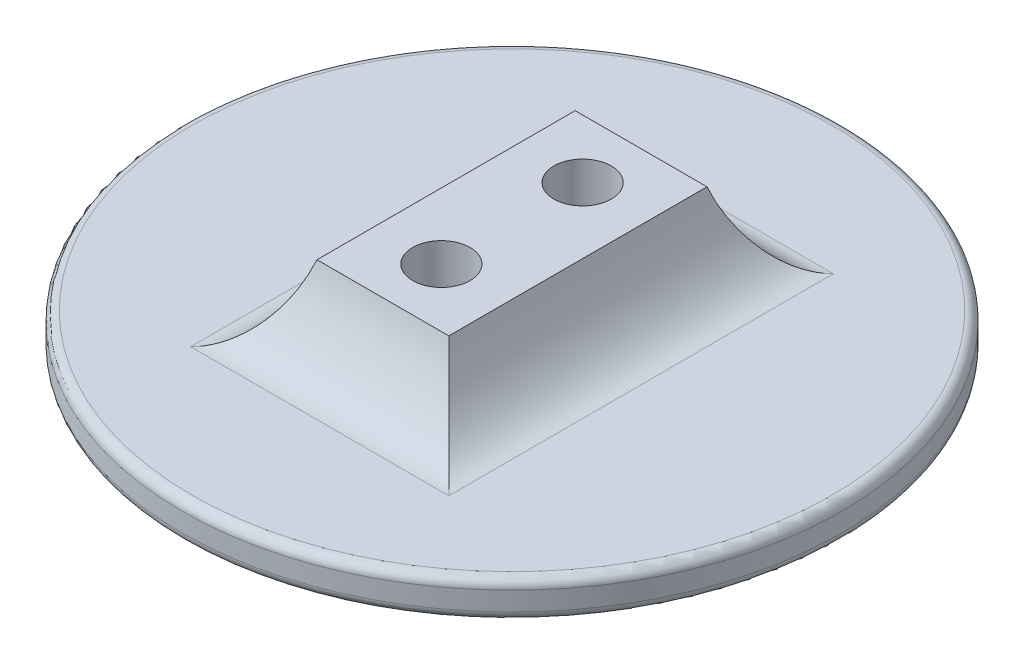
ISO-10303-21;
HEADER;
FILE_DESCRIPTION(('STEP AP214'),'2;1');
FILE_NAME('part.step','',(''),(''),'','','');
FILE_SCHEMA(('AUTOMOTIVE_DESIGN { 1 0 10303 214 1 1 1 1 }'));
ENDSEC;
DATA;
#1=APPLICATION_CONTEXT('core data for automotive mechanical design processes');
#2=APPLICATION_PROTOCOL_DEFINITION('international standard','automotive_design',2000,#1);
#3=PRODUCT_CONTEXT('',#1,'mechanical');
#4=PRODUCT('Part','Part','',(#3));
#5=PRODUCT_RELATED_PRODUCT_CATEGORY('part','',(#4));
#6=PRODUCT_DEFINITION_FORMATION('','',#4);
#7=PRODUCT_DEFINITION_CONTEXT('part definition',#1,'design');
#8=PRODUCT_DEFINITION('design','',#6,#7);
#9=PRODUCT_DEFINITION_SHAPE('','',#8);
#10=(LENGTH_UNIT() NAMED_UNIT(*) SI_UNIT(.MILLI.,.METRE.));
#11=(NAMED_UNIT(*) PLANE_ANGLE_UNIT() SI_UNIT($,.RADIAN.));
#12=(NAMED_UNIT(*) SI_UNIT($,.STERADIAN.) SOLID_ANGLE_UNIT());
#13=UNCERTAINTY_MEASURE_WITH_UNIT(LENGTH_MEASURE(1.E-05),#10,'distance_accuracy_value','');
#14=(GEOMETRIC_REPRESENTATION_CONTEXT(3) GLOBAL_UNCERTAINTY_ASSIGNED_CONTEXT((#13)) GLOBAL_UNIT_ASSIGNED_CONTEXT((#10,
#11,#12)) REPRESENTATION_CONTEXT('',''));
#15=CARTESIAN_POINT('',(0.,0.,0.));
#16=DIRECTION('',(0.,0.,1.));
#17=DIRECTION('',(1.,0.,0.));
#18=AXIS2_PLACEMENT_3D('',#15,#16,#17);
#19=CARTESIAN_POINT('',(0.,0.,0.));
#20=DIRECTION('',(0.,1.,0.));
#21=DIRECTION('',(0.,0.,1.));
#22=AXIS2_PLACEMENT_3D('',#19,#20,#21);
#23=PLANE('',#22);
#24=CARTESIAN_POINT('',(0.,0.,0.));
#25=DIRECTION('',(0.,1.,0.));
#26=DIRECTION('',(0.,0.,1.));
#27=AXIS2_PLACEMENT_3D('',#24,#25,#26);
#28=CIRCLE('',#27,34.);
#29=CARTESIAN_POINT('',(0.,0.,34.));
#30=VERTEX_POINT('',#29);
#31=EDGE_CURVE('E12',#30,#30,#28,.F.);
#32=ORIENTED_EDGE('',*,*,#31,.T.);
#33=EDGE_LOOP('',(#32));
#34=FACE_BOUND('',#33,.T.);
#35=CARTESIAN_POINT('',(0.,0.,7.5));
#36=DIRECTION('',(0.,-1.,0.));
#37=DIRECTION('',(0.,0.,-1.));
#38=AXIS2_PLACEMENT_3D('',#35,#36,#37);
#39=CIRCLE('',#38,5.05);
#40=CARTESIAN_POINT('',(0.,0.,2.45));
#41=VERTEX_POINT('',#40);
#42=EDGE_CURVE('E354',#41,#41,#39,.T.);
#43=ORIENTED_EDGE('',*,*,#42,.F.);
#44=EDGE_LOOP('',(#43));
#45=FACE_BOUND('',#44,.T.);
#46=CARTESIAN_POINT('',(0.,0.,-7.5));
#47=DIRECTION('',(0.,1.,0.));
#48=DIRECTION('',(0.,0.,1.));
#49=AXIS2_PLACEMENT_3D('',#46,#47,#48);
#50=CIRCLE('',#49,5.05);
#51=CARTESIAN_POINT('',(0.,0.,-2.45));
#52=VERTEX_POINT('',#51);
#53=EDGE_CURVE('E350',#52,#52,#50,.T.);
#54=ORIENTED_EDGE('',*,*,#53,.T.);
#55=EDGE_LOOP('',(#54));
#56=FACE_BOUND('',#55,.T.);
#57=ADVANCED_FACE('F45',(#34,#45,#56),#23,.F.);
#58=CARTESIAN_POINT('',(0.,0.,7.5));
#59=DIRECTION('',(0.,1.,0.));
#60=DIRECTION('',(0.,0.,1.));
#61=AXIS2_PLACEMENT_3D('',#58,#59,#60);
#62=CYLINDRICAL_SURFACE('',#61,3.05);
#63=CARTESIAN_POINT('',(0.,12.,7.5));
#64=DIRECTION('',(0.,-1.,0.));
#65=DIRECTION('',(0.,0.,-1.));
#66=AXIS2_PLACEMENT_3D('',#63,#64,#65);
#67=CIRCLE('',#66,3.05);
#68=CARTESIAN_POINT('',(0.,12.,4.45));
#69=VERTEX_POINT('',#68);
#70=EDGE_CURVE('E253',#69,#69,#67,.T.);
#71=ORIENTED_EDGE('',*,*,#70,.F.);
#72=EDGE_LOOP('',(#71));
#73=FACE_BOUND('',#72,.T.);
#74=CARTESIAN_POINT('',(0.,6.1,7.5));
#75=DIRECTION('',(0.,-1.,0.));
#76=DIRECTION('',(0.,0.,-1.));
#77=AXIS2_PLACEMENT_3D('',#74,#75,#76);
#78=CIRCLE('',#77,3.05);
#79=CARTESIAN_POINT('',(0.,6.1,4.45));
#80=VERTEX_POINT('',#79);
#81=EDGE_CURVE('E248',#80,#80,#78,.T.);
#82=ORIENTED_EDGE('',*,*,#81,.T.);
#83=EDGE_LOOP('',(#82));
#84=FACE_BOUND('',#83,.T.);
#85=ADVANCED_FACE('F216',(#73,#84),#62,.F.);
#86=CARTESIAN_POINT('',(0.,12.,0.));
#87=DIRECTION('',(0.,-1.,0.));
#88=DIRECTION('',(0.,0.,-1.));
#89=AXIS2_PLACEMENT_3D('',#86,#87,#88);
#90=PLANE('',#89);
#91=CARTESIAN_POINT('',(7.,12.,-22.4600243257493));
#92=CARTESIAN_POINT('',(7.,12.,-21.7794175279994));
#93=CARTESIAN_POINT('',(7.,12.,-21.0988107302494));
#94=CARTESIAN_POINT('',(7.,12.,-6.80606797749979));
#95=CARTESIAN_POINT('',(7.,12.,6.80606797748798));
#96=CARTESIAN_POINT('',(7.,12.,21.0988107302499));
#97=CARTESIAN_POINT('',(7.,12.,21.7794175279989));
#98=CARTESIAN_POINT('',(7.,12.,22.4600243257493));
#99=(BOUNDED_CURVE() B_SPLINE_CURVE(3,(#91,#92,#93,#94,#95,#96,#97,#98),.UNSPECIFIED.,.F.,
.F.) B_SPLINE_CURVE_WITH_KNOTS((4,2,2,4),(-0.00875002432574931,-0.00670820393249937,
0.0341282039324994,0.0361700243257493),
.UNSPECIFIED.) CURVE() GEOMETRIC_REPRESENTATION_ITEM() RATIONAL_B_SPLINE_CURVE((1.,1.,1.,1.,1.,
1.,1.,1.)) REPRESENTATION_ITEM(''));
#100=CARTESIAN_POINT('',(7.,12.,13.71));
#101=VERTEX_POINT('',#100);
#102=CARTESIAN_POINT('',(7.,12.,-13.71));
#103=VERTEX_POINT('',#102);
#104=EDGE_CURVE('E90',#101,#103,#99,.F.);
#105=ORIENTED_EDGE('',*,*,#104,.T.);
#106=CARTESIAN_POINT('',(-15.0936141291243,12.,-13.71));
#107=CARTESIAN_POINT('',(-14.6318107302497,12.,-13.71));
#108=CARTESIAN_POINT('',(-14.170007331374,12.,-13.71));
#109=CARTESIAN_POINT('',(-4.47213595500759,12.,-13.71));
#110=CARTESIAN_POINT('',(4.76393202250021,12.,-13.71));
#111=CARTESIAN_POINT('',(14.461803398875,12.,-13.71));
#112=CARTESIAN_POINT('',(14.92360679775,12.,-13.71));
#113=CARTESIAN_POINT('',(15.385410196625,12.,-13.71));
#114=(BOUNDED_CURVE() B_SPLINE_CURVE(3,(#106,#107,#108,#109,#110,#111,#112,#113),.UNSPECIFIED.,
.F.,.F.) B_SPLINE_CURVE_WITH_KNOTS((4,2,2,4),(-0.022385410196625,-0.021,0.00670820393249937,
0.00809361412912434),
.UNSPECIFIED.) CURVE() GEOMETRIC_REPRESENTATION_ITEM() RATIONAL_B_SPLINE_CURVE((1.,1.,1.,1.,1.,
1.,1.,1.)) REPRESENTATION_ITEM(''));
#115=CARTESIAN_POINT('',(-7.,12.,-13.71));
#116=VERTEX_POINT('',#115);
#117=EDGE_CURVE('E97',#103,#116,#114,.F.);
#118=ORIENTED_EDGE('',*,*,#117,.T.);
#119=CARTESIAN_POINT('',(-7.,12.,22.781));
#120=CARTESIAN_POINT('',(-7.,12.,22.0906666666662));
#121=CARTESIAN_POINT('',(-7.,12.,21.4003333333339));
#122=CARTESIAN_POINT('',(-7.,12.,6.90333333332136));
#123=CARTESIAN_POINT('',(-7.,12.,-6.90333333333334));
#124=CARTESIAN_POINT('',(-7.,12.,-21.4003333333333));
#125=CARTESIAN_POINT('',(-7.,12.,-22.0906666666667));
#126=CARTESIAN_POINT('',(-7.,12.,-22.781));
#127=(BOUNDED_CURVE() B_SPLINE_CURVE(3,(#119,#120,#121,#122,#123,#124,#125,#126),.UNSPECIFIED.,
.F.,.F.) B_SPLINE_CURVE_WITH_KNOTS((4,2,2,4),(-0.036491,-0.03442,0.007,0.009071),
.UNSPECIFIED.) CURVE() GEOMETRIC_REPRESENTATION_ITEM() RATIONAL_B_SPLINE_CURVE((1.,1.,1.,1.,1.,
1.,1.,1.)) REPRESENTATION_ITEM(''));
#128=CARTESIAN_POINT('',(-7.,12.,13.71));
#129=VERTEX_POINT('',#128);
#130=EDGE_CURVE('E126',#116,#129,#127,.F.);
#131=ORIENTED_EDGE('',*,*,#130,.T.);
#132=CARTESIAN_POINT('',(15.385410196625,12.,13.71));
#133=CARTESIAN_POINT('',(14.92360679775,12.,13.71));
#134=CARTESIAN_POINT('',(14.461803398875,12.,13.71));
#135=CARTESIAN_POINT('',(4.76393202250021,12.,13.71));
#136=CARTESIAN_POINT('',(-4.47213595500759,12.,13.71));
#137=CARTESIAN_POINT('',(-14.170007331374,12.,13.71));
#138=CARTESIAN_POINT('',(-14.6318107302496,12.,13.71));
#139=CARTESIAN_POINT('',(-15.0936141291243,12.,13.71));
#140=(BOUNDED_CURVE() B_SPLINE_CURVE(3,(#132,#133,#134,#135,#136,#137,#138,#139),.UNSPECIFIED.,
.F.,.F.) B_SPLINE_CURVE_WITH_KNOTS((4,2,2,4),(-0.00809361412912434,-0.00670820393249937,0.021,
0.022385410196625),
.UNSPECIFIED.) CURVE() GEOMETRIC_REPRESENTATION_ITEM() RATIONAL_B_SPLINE_CURVE((1.,1.,1.,1.,1.,
1.,1.,1.)) REPRESENTATION_ITEM(''));
#141=EDGE_CURVE('E100',#129,#101,#140,.F.);
#142=ORIENTED_EDGE('',*,*,#141,.T.);
#143=EDGE_LOOP('',(#105,#118,#131,#142));
#144=FACE_BOUND('',#143,.T.);
#145=ORIENTED_EDGE('',*,*,#70,.T.);
#146=EDGE_LOOP('',(#145));
#147=FACE_BOUND('',#146,.T.);
#148=CARTESIAN_POINT('',(0.,12.,-7.5));
#149=DIRECTION('',(0.,1.,0.));
#150=DIRECTION('',(0.,0.,1.));
#151=AXIS2_PLACEMENT_3D('',#148,#149,#150);
#152=CIRCLE('',#151,3.05);
#153=CARTESIAN_POINT('',(0.,12.,-4.45));
#154=VERTEX_POINT('',#153);
#155=EDGE_CURVE('E341',#154,#154,#152,.T.);
#156=ORIENTED_EDGE('',*,*,#155,.F.);
#157=EDGE_LOOP('',(#156));
#158=FACE_BOUND('',#157,.T.);
#159=ADVANCED_FACE('F93',(#144,#147,#158),#90,.F.);
#160=CARTESIAN_POINT('',(0.,4.,0.));
#161=DIRECTION('',(0.,-1.,0.));
#162=DIRECTION('',(0.,0.,-1.));
#163=AXIS2_PLACEMENT_3D('',#160,#161,#162);
#164=CYLINDRICAL_SURFACE('',#163,35.);
#165=CARTESIAN_POINT('',(0.,3.,0.));
#166=DIRECTION('',(0.,1.,0.));
#167=DIRECTION('',(0.,0.,1.));
#168=AXIS2_PLACEMENT_3D('',#165,#166,#167);
#169=CIRCLE('',#168,35.);
#170=CARTESIAN_POINT('',(0.,3.,35.));
#171=VERTEX_POINT('',#170);
#172=EDGE_CURVE('E54',#171,#171,#169,.F.);
#173=ORIENTED_EDGE('',*,*,#172,.T.);
#174=EDGE_LOOP('',(#173));
#175=FACE_BOUND('',#174,.T.);
#176=CARTESIAN_POINT('',(0.,1.,0.));
#177=DIRECTION('',(0.,1.,0.));
#178=DIRECTION('',(0.,0.,1.));
#179=AXIS2_PLACEMENT_3D('',#176,#177,#178);
#180=CIRCLE('',#179,35.);
#181=CARTESIAN_POINT('',(0.,1.,35.));
#182=VERTEX_POINT('',#181);
#183=EDGE_CURVE('E258',#182,#182,#180,.T.);
#184=ORIENTED_EDGE('',*,*,#183,.T.);
#185=EDGE_LOOP('',(#184));
#186=FACE_BOUND('',#185,.T.);
#187=ADVANCED_FACE('F215',(#175,#186),#164,.T.);
#188=CARTESIAN_POINT('',(0.,4.,0.));
#189=DIRECTION('',(0.,1.,0.));
#190=DIRECTION('',(0.,0.,1.));
#191=AXIS2_PLACEMENT_3D('',#188,#189,#190);
#192=PLANE('',#191);
#193=CARTESIAN_POINT('',(0.,4.,0.));
#194=DIRECTION('',(0.,1.,0.));
#195=DIRECTION('',(0.,0.,1.));
#196=AXIS2_PLACEMENT_3D('',#193,#194,#195);
#197=CIRCLE('',#196,34.);
#198=CARTESIAN_POINT('',(0.,4.,34.));
#199=VERTEX_POINT('',#198);
#200=EDGE_CURVE('E254',#199,#199,#197,.T.);
#201=ORIENTED_EDGE('',*,*,#200,.T.);
#202=EDGE_LOOP('',(#201));
#203=FACE_BOUND('',#202,.T.);
#204=CARTESIAN_POINT('',(-15.0936141291243,4.,20.4182039324994));
#205=CARTESIAN_POINT('',(-14.6318107302496,4.,20.4182039324994));
#206=CARTESIAN_POINT('',(-14.170007331374,4.,20.4182039324994));
#207=CARTESIAN_POINT('',(-4.47213595500759,4.,20.4182039324994));
#208=CARTESIAN_POINT('',(4.76393202250021,4.,20.4182039324994));
#209=CARTESIAN_POINT('',(14.461803398875,4.,20.4182039324994));
#210=CARTESIAN_POINT('',(14.92360679775,4.,20.4182039324994));
#211=CARTESIAN_POINT('',(15.385410196625,4.,20.4182039324994));
#212=(BOUNDED_CURVE() B_SPLINE_CURVE(3,(#204,#205,#206,#207,#208,#209,#210,#211),.UNSPECIFIED.,
.F.,.F.) B_SPLINE_CURVE_WITH_KNOTS((4,2,2,4),(-0.00809361412912434,-0.00670820393249937,0.021,
0.022385410196625),
.UNSPECIFIED.) CURVE() GEOMETRIC_REPRESENTATION_ITEM() RATIONAL_B_SPLINE_CURVE((1.,1.,1.,1.,1.,
1.,1.,1.)) REPRESENTATION_ITEM(''));
#213=CARTESIAN_POINT('',(13.7082039324994,4.,20.4182039325293));
#214=VERTEX_POINT('',#213);
#215=CARTESIAN_POINT('',(-13.7082039324793,4.,20.4182039324994));
#216=VERTEX_POINT('',#215);
#217=EDGE_CURVE('E70',#214,#216,#212,.F.);
#218=ORIENTED_EDGE('',*,*,#217,.T.);
#219=CARTESIAN_POINT('',(-13.7082039324994,4.,-22.781));
#220=CARTESIAN_POINT('',(-13.7082039324994,4.,-22.0906666666667));
#221=CARTESIAN_POINT('',(-13.7082039324994,4.,-21.4003333333333));
#222=CARTESIAN_POINT('',(-13.7082039324994,4.,-6.90333333333334));
#223=CARTESIAN_POINT('',(-13.7082039324994,4.,6.90333333332136));
#224=CARTESIAN_POINT('',(-13.7082039324994,4.,21.4003333333339));
#225=CARTESIAN_POINT('',(-13.7082039324994,4.,22.0906666666662));
#226=CARTESIAN_POINT('',(-13.7082039324994,4.,22.781));
#227=(BOUNDED_CURVE() B_SPLINE_CURVE(3,(#219,#220,#221,#222,#223,#224,#225,#226),.UNSPECIFIED.,
.F.,.F.) B_SPLINE_CURVE_WITH_KNOTS((4,2,2,4),(-0.036491,-0.03442,0.007,0.009071),
.UNSPECIFIED.) CURVE() GEOMETRIC_REPRESENTATION_ITEM() RATIONAL_B_SPLINE_CURVE((1.,1.,1.,1.,1.,
1.,1.,1.)) REPRESENTATION_ITEM(''));
#228=CARTESIAN_POINT('',(-13.7082039324786,4.,-20.4182039324994));
#229=VERTEX_POINT('',#228);
#230=EDGE_CURVE('E259',#216,#229,#227,.F.);
#231=ORIENTED_EDGE('',*,*,#230,.T.);
#232=CARTESIAN_POINT('',(15.385410196625,4.,-20.4182039324994));
#233=CARTESIAN_POINT('',(14.92360679775,4.,-20.4182039324994));
#234=CARTESIAN_POINT('',(14.461803398875,4.,-20.4182039324994));
#235=CARTESIAN_POINT('',(4.76393202250021,4.,-20.4182039324994));
#236=CARTESIAN_POINT('',(-4.47213595500759,4.,-20.4182039324994));
#237=CARTESIAN_POINT('',(-14.170007331374,4.,-20.4182039324994));
#238=CARTESIAN_POINT('',(-14.6318107302497,4.,-20.4182039324994));
#239=CARTESIAN_POINT('',(-15.0936141291243,4.,-20.4182039324994));
#240=(BOUNDED_CURVE() B_SPLINE_CURVE(3,(#232,#233,#234,#235,#236,#237,#238,#239),.UNSPECIFIED.,
.F.,.F.) B_SPLINE_CURVE_WITH_KNOTS((4,2,2,4),(-0.022385410196625,-0.021,0.00670820393249937,
0.00809361412912434),
.UNSPECIFIED.) CURVE() GEOMETRIC_REPRESENTATION_ITEM() RATIONAL_B_SPLINE_CURVE((1.,1.,1.,1.,1.,
1.,1.,1.)) REPRESENTATION_ITEM(''));
#241=CARTESIAN_POINT('',(13.7082039324994,4.,-20.4182039324982));
#242=VERTEX_POINT('',#241);
#243=EDGE_CURVE('E383',#229,#242,#240,.F.);
#244=ORIENTED_EDGE('',*,*,#243,.T.);
#245=CARTESIAN_POINT('',(13.7082039324994,4.,22.4600243257493));
#246=CARTESIAN_POINT('',(13.7082039324994,4.,21.7794175279989));
#247=CARTESIAN_POINT('',(13.7082039324994,4.,21.0988107302499));
#248=CARTESIAN_POINT('',(13.7082039324994,4.,6.80606797748798));
#249=CARTESIAN_POINT('',(13.7082039324994,4.,-6.80606797749979));
#250=CARTESIAN_POINT('',(13.7082039324994,4.,-21.0988107302494));
#251=CARTESIAN_POINT('',(13.7082039324994,4.,-21.7794175279994));
#252=CARTESIAN_POINT('',(13.7082039324994,4.,-22.4600243257493));
#253=(BOUNDED_CURVE() B_SPLINE_CURVE(3,(#245,#246,#247,#248,#249,#250,#251,#252),.UNSPECIFIED.,
.F.,.F.) B_SPLINE_CURVE_WITH_KNOTS((4,2,2,4),(-0.00875002432574931,-0.00670820393249937,
0.0341282039324994,0.0361700243257493),
.UNSPECIFIED.) CURVE() GEOMETRIC_REPRESENTATION_ITEM() RATIONAL_B_SPLINE_CURVE((1.,1.,1.,1.,1.,
1.,1.,1.)) REPRESENTATION_ITEM(''));
#254=EDGE_CURVE('E114',#242,#214,#253,.F.);
#255=ORIENTED_EDGE('',*,*,#254,.T.);
#256=EDGE_LOOP('',(#218,#231,#244,#255));
#257=FACE_BOUND('',#256,.T.);
#258=ADVANCED_FACE('F218',(#203,#257),#192,.T.);
#259=CARTESIAN_POINT('',(7.,12.,22.4600243257493));
#260=CARTESIAN_POINT('',(7.,12.,21.7794175279989));
#261=CARTESIAN_POINT('',(7.,12.,21.0988107302499));
#262=CARTESIAN_POINT('',(7.,12.,6.80606797748798));
#263=CARTESIAN_POINT('',(7.,12.,-6.80606797749979));
#264=CARTESIAN_POINT('',(7.,12.,-21.0988107302494));
#265=CARTESIAN_POINT('',(7.,12.,-21.7794175279994));
#266=CARTESIAN_POINT('',(7.,12.,-22.4600243257493));
#267=CARTESIAN_POINT('',(9.38513917599978,4.,22.4600243257493));
#268=CARTESIAN_POINT('',(9.38513917599978,4.,21.7794175279989));
#269=CARTESIAN_POINT('',(9.38513917599978,4.,21.0988107302499));
#270=CARTESIAN_POINT('',(9.38513917599978,4.,6.80606797748798));
#271=CARTESIAN_POINT('',(9.38513917599978,4.,-6.80606797749979));
#272=CARTESIAN_POINT('',(9.38513917599978,4.,-21.0988107302494));
#273=CARTESIAN_POINT('',(9.38513917599978,4.,-21.7794175279994));
#274=CARTESIAN_POINT('',(9.38513917599978,4.,-22.4600243257493));
#275=CARTESIAN_POINT('',(13.7082039324994,4.,22.4600243257493));
#276=CARTESIAN_POINT('',(13.7082039324994,4.,21.7794175279989));
#277=CARTESIAN_POINT('',(13.7082039324994,4.,21.0988107302499));
#278=CARTESIAN_POINT('',(13.7082039324994,4.,6.80606797748798));
#279=CARTESIAN_POINT('',(13.7082039324994,4.,-6.80606797749979));
#280=CARTESIAN_POINT('',(13.7082039324994,4.,-21.0988107302494));
#281=CARTESIAN_POINT('',(13.7082039324994,4.,-21.7794175279994));
#282=CARTESIAN_POINT('',(13.7082039324994,4.,-22.4600243257493));
#283=(BOUNDED_SURFACE() B_SPLINE_SURFACE(2,3,((#259,#260,#261,#262,#263,#264,#265,#266),(#267,
#268,#269,#270,#271,#272,#273,#274),(#275,#276,#277,#278,#279,#280,#281,#282)),.UNSPECIFIED.,
.F.,.F.,.F.) B_SPLINE_SURFACE_WITH_KNOTS((3,3),(4,2,2,4),(0.,1.),(-0.00875002432574931,
-0.00670820393249937,0.0341282039324994,0.0361700243257493),
.UNSPECIFIED.) GEOMETRIC_REPRESENTATION_ITEM() RATIONAL_B_SPLINE_SURFACE(((1.,1.,1.,1.,1.,1.,1.,
1.),(0.801783725737273,0.801783725737273,0.801783725737273,0.801783725737273,0.801783725737273,
0.801783725737273,0.801783725737273,0.801783725737273),(1.,1.,1.,1.,1.,1.,1.,1.))) REPRESENTATION_ITEM('') SURFACE());
#284=CARTESIAN_POINT('',(13.7082039324988,4.,20.4182039324994));
#285=CARTESIAN_POINT('',(13.6417895625206,4.00000349653432,20.3518274266069));
#286=CARTESIAN_POINT('',(13.5752809352578,4.00220061185273,20.2855539377166));
#287=CARTESIAN_POINT('',(13.4346060989288,4.01133962607072,20.1455635618125));
#288=CARTESIAN_POINT('',(13.3604457826429,4.01880193673533,20.0718742330786));
#289=CARTESIAN_POINT('',(13.2044550077406,4.03990288779184,19.9167895399704));
#290=CARTESIAN_POINT('',(13.1226691913486,4.05412586824501,19.8354293163506));
#291=CARTESIAN_POINT('',(12.9513769806224,4.09035500890565,19.6647996488734));
#292=CARTESIAN_POINT('',(12.861951675258,4.11301648975002,19.5755870888774));
#293=CARTESIAN_POINT('',(12.7253923913265,4.15316894380241,19.4391304779178));
#294=CARTESIAN_POINT('',(12.6778364086384,4.16820028935164,19.3915682468379));
#295=CARTESIAN_POINT('',(12.5807959130184,4.20097258689868,19.2944394585751));
#296=CARTESIAN_POINT('',(12.5313293313628,4.21880941067549,19.2448871824606));
#297=CARTESIAN_POINT('',(12.4304673825444,4.25743937377776,19.143782275056));
#298=CARTESIAN_POINT('',(12.379092907595,4.27833309968951,19.0922473092782));
#299=CARTESIAN_POINT('',(12.2744115323633,4.32333121111007,18.9871874941944));
#300=CARTESIAN_POINT('',(12.2211283979482,4.34754081218137,18.9336840487319));
#301=CARTESIAN_POINT('',(12.1126277616897,4.39943121052777,18.8247077051233));
#302=CARTESIAN_POINT('',(12.057437030067,4.42722166842132,18.7692604149373));
#303=CARTESIAN_POINT('',(11.9451156734313,4.48653688990395,18.6564302165324));
#304=CARTESIAN_POINT('',(11.8880146560422,4.51817537933172,18.5990776736791));
#305=CARTESIAN_POINT('',(11.7718806554893,4.58545910631418,18.4824731244478));
#306=CARTESIAN_POINT('',(11.7128806940318,4.62122205398695,18.4232561849005));
#307=CARTESIAN_POINT('',(11.5929035842568,4.69699932385454,18.3030126148536));
#308=CARTESIAN_POINT('',(11.5319602740556,4.73713351948952,18.2420279834077));
#309=CARTESIAN_POINT('',(11.3631994806993,4.85292781748934,18.0730782216487));
#310=CARTESIAN_POINT('',(11.256429454003,4.93158117688236,17.9661023029958));
#311=CARTESIAN_POINT('',(11.0511194906082,5.09298648239094,17.7600951848603));
#312=CARTESIAN_POINT('',(10.9524284169818,5.17537318602018,17.6609266855438));
#313=CARTESIAN_POINT('',(10.7631779162123,5.34198901363896,17.4708769919888));
#314=CARTESIAN_POINT('',(10.6724690431924,5.42587059395453,17.3798392634216));
#315=CARTESIAN_POINT('',(10.4992048159012,5.59344488368518,17.2061780236266));
#316=CARTESIAN_POINT('',(10.4164981360053,5.67680930490486,17.1233879156304));
#317=CARTESIAN_POINT('',(10.2592309569502,5.84151450631904,16.9662338837575));
#318=CARTESIAN_POINT('',(10.1845201802333,5.92254944518457,16.8916994426299));
#319=CARTESIAN_POINT('',(10.0432402081933,6.08096970411226,16.750974096913));
#320=CARTESIAN_POINT('',(9.97652159374262,6.15807351098827,16.6846151903923));
#321=CARTESIAN_POINT('',(9.79873630594291,6.36976534913209,16.5078583519748));
#322=CARTESIAN_POINT('',(9.6891857419943,6.5069475662991,16.3990171203244));
#323=CARTESIAN_POINT('',(9.50849646722299,6.74554176920894,16.2186132385214));
#324=CARTESIAN_POINT('',(9.43590466604903,6.84498189334314,16.1458789039672));
#325=CARTESIAN_POINT('',(9.29368613446014,7.0460490745664,16.0034491956527));
#326=CARTESIAN_POINT('',(9.22403671674213,7.14764349045587,15.93373039593));
#327=CARTESIAN_POINT('',(9.0878073979754,7.35256670334447,15.7973531405494));
#328=CARTESIAN_POINT('',(9.0212006200043,7.45585984172089,15.730667928593));
#329=CARTESIAN_POINT('',(8.89103642094523,7.66369030701506,15.6004020328779));
#330=CARTESIAN_POINT('',(8.82744943257543,7.76819020894732,15.5367910278791));
#331=CARTESIAN_POINT('',(8.64285363370195,8.08019486376557,15.3522154293242));
#332=CARTESIAN_POINT('',(8.5247231628667,8.29118003929419,15.234215747407));
#333=CARTESIAN_POINT('',(8.30084441684238,8.71320225795151,15.0106421912218));
#334=CARTESIAN_POINT('',(8.19479335100716,8.92391863935844,14.9047636339182));
#335=CARTESIAN_POINT('',(7.98221212849959,9.36939036807786,14.6922441923181));
#336=CARTESIAN_POINT('',(7.87630548428174,9.60472999920428,14.5862033778112));
#337=CARTESIAN_POINT('',(7.67451018998432,10.079158135804,14.3842165298138));
#338=CARTESIAN_POINT('',(7.5784970131537,10.3181404500388,14.2881448682402));
#339=CARTESIAN_POINT('',(7.3965405278942,10.7976214782141,14.1062036967099));
#340=CARTESIAN_POINT('',(7.31043552830883,11.0379965665371,14.0201699003796));
#341=CARTESIAN_POINT('',(7.1483692051331,11.5182246321609,13.8582557881754));
#342=CARTESIAN_POINT('',(7.07220993283896,11.7579439867401,13.7821772381415));
#343=CARTESIAN_POINT('',(7.,12.,13.71));
#344=B_SPLINE_CURVE_WITH_KNOTS('',3,(#284,#285,#286,#287,#288,#289,#290,#291,#292,#293,#294,
#295,#296,#297,#298,#299,#300,#301,#302,#303,#304,#305,#306,#307,#308,#309,#310,#311,#312,#313,
#314,#315,#316,#317,#318,#319,#320,#321,#322,#323,#324,#325,#326,#327,#328,#329,#330,#331,#332,
#333,#334,#335,#336,#337,#338,#339,#340,#341,#342,#343),.UNSPECIFIED.,.F.,.F.,(4,2,2,2,2,2,2,2,
2,2,2,2,2,2,2,2,2,2,2,2,2,2,2,2,2,2,2,2,2,4),(0.,0.281658932295383,0.595962452752174,
0.944509848068291,1.32928491578284,1.53601491959108,1.75274055310937,1.97983069564997,
2.21768001715595,2.46670694493651,2.72735069479729,3.00006728516487,3.28532447451598,
3.79618471601194,4.28308507564434,4.74334055699399,5.17427978886192,5.5733676826286,
5.93828786094349,6.55766388043344,6.98658468306476,7.41113163998584,7.83056203805628,
8.24414469131746,9.05090347993054,9.82630978204883,10.6629491641282,11.4872720553776,
12.2952800904811,13.0833396941816),.UNSPECIFIED.);
#345=EDGE_CURVE('E119',#214,#101,#344,.T.);
#346=CARTESIAN_POINT('',(7.,12.,-13.71));
#347=CARTESIAN_POINT('',(7.07220993283896,11.7579439867401,-13.7821772381415));
#348=CARTESIAN_POINT('',(7.1483692051331,11.5182246321608,-13.8582557881754));
#349=CARTESIAN_POINT('',(7.31043552830884,11.0379965665371,-14.0201699003796));
#350=CARTESIAN_POINT('',(7.3965405278942,10.7976214782141,-14.1062036967099));
#351=CARTESIAN_POINT('',(7.5784970131537,10.3181404500388,-14.2881448682402));
#352=CARTESIAN_POINT('',(7.67451018998433,10.079158135804,-14.3842165298138));
#353=CARTESIAN_POINT('',(7.87630548428174,9.60472999920428,-14.5862033778113));
#354=CARTESIAN_POINT('',(7.98221212849959,9.36939036807786,-14.6922441923181));
#355=CARTESIAN_POINT('',(8.19479335100715,8.92391863935844,-14.9047636339182));
#356=CARTESIAN_POINT('',(8.30084441684238,8.71320225795151,-15.0106421912218));
#357=CARTESIAN_POINT('',(8.5247231628667,8.29118003929419,-15.234215747407));
#358=CARTESIAN_POINT('',(8.64285363370195,8.08019486376557,-15.3522154293242));
#359=CARTESIAN_POINT('',(8.82744943257542,7.76819020894733,-15.5367910278791));
#360=CARTESIAN_POINT('',(8.89103642094523,7.66369030701507,-15.6004020328779));
#361=CARTESIAN_POINT('',(9.0212006200043,7.4558598417209,-15.730667928593));
#362=CARTESIAN_POINT('',(9.08780739797539,7.35256670334448,-15.7973531405494));
#363=CARTESIAN_POINT('',(9.22403671674213,7.14764349045587,-15.93373039593));
#364=CARTESIAN_POINT('',(9.29368613446013,7.04604907456641,-16.0034491956527));
#365=CARTESIAN_POINT('',(9.43590466604902,6.84498189334315,-16.1458789039672));
#366=CARTESIAN_POINT('',(9.50849646722298,6.74554176920894,-16.2186132385214));
#367=CARTESIAN_POINT('',(9.6891857419943,6.5069475662991,-16.3990171203244));
#368=CARTESIAN_POINT('',(9.79873630594292,6.36976534913208,-16.5078583519748));
#369=CARTESIAN_POINT('',(9.97652159374264,6.15807351098824,-16.6846151903923));
#370=CARTESIAN_POINT('',(10.0432402081933,6.08096970411223,-16.750974096913));
#371=CARTESIAN_POINT('',(10.1845201802333,5.92254944518454,-16.8916994426299));
#372=CARTESIAN_POINT('',(10.2592309569503,5.84151450631901,-16.9662338837575));
#373=CARTESIAN_POINT('',(10.4164981360054,5.67680930490484,-17.1233879156305));
#374=CARTESIAN_POINT('',(10.4992048159012,5.59344488368515,-17.2061780236267));
#375=CARTESIAN_POINT('',(10.6724690431925,5.4258705939545,-17.3798392634216));
#376=CARTESIAN_POINT('',(10.7631779162124,5.34198901363894,-17.4708769919888));
#377=CARTESIAN_POINT('',(10.9524284169819,5.17537318602016,-17.6609266855438));
#378=CARTESIAN_POINT('',(11.0511194906082,5.09298648239092,-17.7600951848603));
#379=CARTESIAN_POINT('',(11.2564294540031,4.93158117688236,-17.9661023029958));
#380=CARTESIAN_POINT('',(11.3631994806994,4.85292781748935,-18.0730782216487));
#381=CARTESIAN_POINT('',(11.5319602739974,4.73713351952942,-18.2420279833495));
#382=CARTESIAN_POINT('',(11.5929035841395,4.69699932393171,-18.3030126147364));
#383=CARTESIAN_POINT('',(11.7128806938039,4.6212220541271,-18.4232561846732));
#384=CARTESIAN_POINT('',(11.7718806552102,4.58545910648059,-18.4824731241696));
#385=CARTESIAN_POINT('',(11.8880146556684,4.51817537954065,-18.5990776733073));
#386=CARTESIAN_POINT('',(11.945115673014,4.48653689012965,-18.656430216118));
#387=CARTESIAN_POINT('',(12.0574370295707,4.42722166867208,-18.769260414446));
#388=CARTESIAN_POINT('',(12.1126277611579,4.39943121078731,-18.8247077045978));
#389=CARTESIAN_POINT('',(12.2211283973533,4.34754081245142,-18.9336840481461));
#390=CARTESIAN_POINT('',(12.2744115317408,4.32333121138232,-18.9871874935827));
#391=CARTESIAN_POINT('',(12.3790929069251,4.2783330999605,-19.0922473086227));
#392=CARTESIAN_POINT('',(12.4304673818547,4.25743937404571,-19.1437822743827));
#393=CARTESIAN_POINT('',(12.5313293306414,4.21880941093301,-19.2448871817598));
#394=CARTESIAN_POINT('',(12.5807959122852,4.20097258714919,-19.2944394578647));
#395=CARTESIAN_POINT('',(12.6778364078894,4.16820028958497,-19.3915682461159));
#396=CARTESIAN_POINT('',(12.7253923905735,4.15316894402591,-19.4391304771939));
#397=CARTESIAN_POINT('',(12.8619516745162,4.11301648993845,-19.5755870881706));
#398=CARTESIAN_POINT('',(12.9513769798962,4.09035500907014,-19.6647996481859));
#399=CARTESIAN_POINT('',(13.122669190685,4.05412586835996,-19.8354293157304));
#400=CARTESIAN_POINT('',(13.2044550071241,4.03990288788319,-19.9167895393982));
#401=CARTESIAN_POINT('',(13.3604457821523,4.01880193678421,-20.0718742326297));
#402=CARTESIAN_POINT('',(13.4346060985168,4.01133962610233,-20.1455635614389));
#403=CARTESIAN_POINT('',(13.575280935035,4.00220061185923,-20.2855539375181));
#404=CARTESIAN_POINT('',(13.6417895624081,4.00000349653423,-20.3518274265088));
#405=CARTESIAN_POINT('',(13.7082039324988,4.,-20.4182039324994));
#406=B_SPLINE_CURVE_WITH_KNOTS('',3,(#346,#347,#348,#349,#350,#351,#352,#353,#354,#355,#356,
#357,#358,#359,#360,#361,#362,#363,#364,#365,#366,#367,#368,#369,#370,#371,#372,#373,#374,#375,
#376,#377,#378,#379,#380,#381,#382,#383,#384,#385,#386,#387,#388,#389,#390,#391,#392,#393,#394,
#395,#396,#397,#398,#399,#400,#401,#402,#403,#404,#405),.UNSPECIFIED.,.F.,.F.,(4,2,2,2,2,2,2,2,
2,2,2,2,2,2,2,2,2,2,2,2,2,2,2,2,2,2,2,2,2,4),(0.,0.788059603700489,1.59606763880401,
2.42039053005344,3.25702991213277,4.03243621425106,4.83919500286414,5.25277765612532,
5.67220805419575,6.09675501111684,6.52567581374816,7.14505183323815,7.50997201155305,
7.90905990531974,8.33999913718766,8.8002546185373,9.28715497816968,9.79801521966562,
10.0832724087424,10.3559889988799,10.6166327485527,10.8656596761852,11.1035089975811,
11.3305991400478,11.547324773527,11.7540547773297,12.1388298451297,12.4873772406549,
12.8016807614405,13.0833396941826),.UNSPECIFIED.);
#407=EDGE_CURVE('E107',#103,#242,#406,.T.);
#408=ORIENTED_EDGE('',*,*,#345,.F.);
#409=ORIENTED_EDGE('',*,*,#254,.F.);
#410=ORIENTED_EDGE('',*,*,#407,.F.);
#411=ORIENTED_EDGE('',*,*,#104,.F.);
#412=EDGE_LOOP('',(#408,#409,#410,#411));
#413=FACE_BOUND('',#412,.T.);
#414=ADVANCED_FACE('F113',(#413),#283,.T.);
#415=CARTESIAN_POINT('',(15.385410196625,12.,-13.71));
#416=CARTESIAN_POINT('',(14.92360679775,12.,-13.71));
#417=CARTESIAN_POINT('',(14.461803398875,12.,-13.71));
#418=CARTESIAN_POINT('',(4.76393202250021,12.,-13.71));
#419=CARTESIAN_POINT('',(-4.47213595500759,12.,-13.71));
#420=CARTESIAN_POINT('',(-14.170007331374,12.,-13.71));
#421=CARTESIAN_POINT('',(-14.6318107302497,12.,-13.71));
#422=CARTESIAN_POINT('',(-15.0936141291243,12.,-13.71));
#423=CARTESIAN_POINT('',(15.385410196625,4.,-16.0951391759998));
#424=CARTESIAN_POINT('',(14.92360679775,4.,-16.0951391759998));
#425=CARTESIAN_POINT('',(14.461803398875,4.,-16.0951391759998));
#426=CARTESIAN_POINT('',(4.76393202250021,4.,-16.0951391759998));
#427=CARTESIAN_POINT('',(-4.47213595500759,4.,-16.0951391759998));
#428=CARTESIAN_POINT('',(-14.170007331374,4.,-16.0951391759998));
#429=CARTESIAN_POINT('',(-14.6318107302497,4.,-16.0951391759998));
#430=CARTESIAN_POINT('',(-15.0936141291243,4.,-16.0951391759998));
#431=CARTESIAN_POINT('',(15.385410196625,4.,-20.4182039324994));
#432=CARTESIAN_POINT('',(14.92360679775,4.,-20.4182039324994));
#433=CARTESIAN_POINT('',(14.461803398875,4.,-20.4182039324994));
#434=CARTESIAN_POINT('',(4.76393202250021,4.,-20.4182039324994));
#435=CARTESIAN_POINT('',(-4.47213595500759,4.,-20.4182039324994));
#436=CARTESIAN_POINT('',(-14.170007331374,4.,-20.4182039324994));
#437=CARTESIAN_POINT('',(-14.6318107302497,4.,-20.4182039324994));
#438=CARTESIAN_POINT('',(-15.0936141291243,4.,-20.4182039324994));
#439=(BOUNDED_SURFACE() B_SPLINE_SURFACE(2,3,((#415,#416,#417,#418,#419,#420,#421,#422),(#423,
#424,#425,#426,#427,#428,#429,#430),(#431,#432,#433,#434,#435,#436,#437,#438)),.UNSPECIFIED.,
.F.,.F.,.F.) B_SPLINE_SURFACE_WITH_KNOTS((3,3),(4,2,2,4),(0.,1.),(-0.022385410196625,-0.021,
0.00670820393249937,0.00809361412912434),
.UNSPECIFIED.) GEOMETRIC_REPRESENTATION_ITEM() RATIONAL_B_SPLINE_SURFACE(((1.,1.,1.,1.,1.,1.,1.,
1.),(0.801783725737273,0.801783725737273,0.801783725737273,0.801783725737273,0.801783725737273,
0.801783725737273,0.801783725737273,0.801783725737273),(1.,1.,1.,1.,1.,1.,1.,1.))) REPRESENTATION_ITEM('') SURFACE());
#440=CARTESIAN_POINT('',(-7.,12.,-13.71));
#441=CARTESIAN_POINT('',(-7.07217723814152,11.7579439867401,-13.782209932839));
#442=CARTESIAN_POINT('',(-7.14825578817538,11.5182246321609,-13.8583692051331));
#443=CARTESIAN_POINT('',(-7.3101699003796,11.0379965665371,-14.0204355283088));
#444=CARTESIAN_POINT('',(-7.39620369670989,10.7976214782141,-14.1065405278942));
#445=CARTESIAN_POINT('',(-7.57814486824021,10.3181404500388,-14.2884970131537));
#446=CARTESIAN_POINT('',(-7.67421652981383,10.079158135804,-14.3845101899843));
#447=CARTESIAN_POINT('',(-7.87620337781126,9.60472999920425,-14.5863054842818));
#448=CARTESIAN_POINT('',(-7.98224419231811,9.36939036807783,-14.6922121284996));
#449=CARTESIAN_POINT('',(-8.19476363391823,8.9239186393584,-14.9047933510072));
#450=CARTESIAN_POINT('',(-8.30064219122185,8.71320225795148,-15.0108444168424));
#451=CARTESIAN_POINT('',(-8.52421574740706,8.29118003929416,-15.2347231628667));
#452=CARTESIAN_POINT('',(-8.64221542932417,8.08019486376554,-15.352853633702));
#453=CARTESIAN_POINT('',(-8.82679102787912,7.76819020894729,-15.5374494325755));
#454=CARTESIAN_POINT('',(-8.89040203287795,7.66369030701502,-15.6010364209453));
#455=CARTESIAN_POINT('',(-9.020667928593,7.45585984172085,-15.7312006200043));
#456=CARTESIAN_POINT('',(-9.0873531405494,7.35256670334443,-15.7978073979754));
#457=CARTESIAN_POINT('',(-9.22373039593008,7.14764349045582,-15.9340367167422));
#458=CARTESIAN_POINT('',(-9.29344919565279,7.04604907456635,-16.0036861344602));
#459=CARTESIAN_POINT('',(-9.43587890396721,6.84498189334309,-16.1459046660491));
#460=CARTESIAN_POINT('',(-9.50861323852144,6.74554176920888,-16.218496467223));
#461=CARTESIAN_POINT('',(-9.68901712032433,6.50694756629918,-16.3991857419942));
#462=CARTESIAN_POINT('',(-9.79785835197459,6.36976534913232,-16.5087363059427));
#463=CARTESIAN_POINT('',(-9.97461519039198,6.15807351098866,-16.6865215937423));
#464=CARTESIAN_POINT('',(-10.0409740969126,6.08096970411268,-16.753240208193));
#465=CARTESIAN_POINT('',(-10.1816994426295,5.92254944518502,-16.8945201802329));
#466=CARTESIAN_POINT('',(-10.2562338837571,5.84151450631948,-16.9692309569498));
#467=CARTESIAN_POINT('',(-10.41338791563,5.67680930490529,-17.1264981360049));
#468=CARTESIAN_POINT('',(-10.4961780236262,5.59344488368558,-17.2092048159008));
#469=CARTESIAN_POINT('',(-10.6698392634212,5.42587059395487,-17.3824690431921));
#470=CARTESIAN_POINT('',(-10.7608769919885,5.34198901363926,-17.4731779162121));
#471=CARTESIAN_POINT('',(-10.9509266855436,5.17537318602038,-17.6624284169816));
#472=CARTESIAN_POINT('',(-11.0500951848601,5.09298648239109,-17.761119490608));
#473=CARTESIAN_POINT('',(-11.2561023029957,4.93158117688241,-17.966429454003));
#474=CARTESIAN_POINT('',(-11.3630782216487,4.85292781748934,-18.0731994806994));
#475=CARTESIAN_POINT('',(-11.5320279833536,4.73713351952665,-18.2419602740015));
#476=CARTESIAN_POINT('',(-11.5930126147444,4.69699932392641,-18.3029035841476));
#477=CARTESIAN_POINT('',(-11.7132561846887,4.62122205411753,-18.4228806938195));
#478=CARTESIAN_POINT('',(-11.7724731241885,4.58545910646924,-18.4818806552293));
#479=CARTESIAN_POINT('',(-11.8890776733327,4.51817537952641,-18.5980146556939));
#480=CARTESIAN_POINT('',(-11.9464302161462,4.48653689011428,-18.6551156730425));
#481=CARTESIAN_POINT('',(-12.0592604144795,4.42722166865501,-18.7674370296046));
#482=CARTESIAN_POINT('',(-12.1147077046336,4.39943121076964,-18.8226277611942));
#483=CARTESIAN_POINT('',(-12.223684048186,4.34754081243304,-18.9311283973938));
#484=CARTESIAN_POINT('',(-12.2771874936243,4.32333121136379,-18.9844115317832));
#485=CARTESIAN_POINT('',(-12.3822473086673,4.27833309994207,-19.0890929069707));
#486=CARTESIAN_POINT('',(-12.4337822744285,4.25743937402749,-19.1404673819017));
#487=CARTESIAN_POINT('',(-12.5348871818075,4.2188094109155,-19.2413293306906));
#488=CARTESIAN_POINT('',(-12.584439457913,4.20097258713216,-19.2907959123352));
#489=CARTESIAN_POINT('',(-12.681568246165,4.1682002895691,-19.3878364079404));
#490=CARTESIAN_POINT('',(-12.7291304772431,4.15316894401071,-19.4353923906248));
#491=CARTESIAN_POINT('',(-12.8655870882186,4.11301648992563,-19.5719516745667));
#492=CARTESIAN_POINT('',(-12.9547996482326,4.09035500905896,-19.6613769799457));
#493=CARTESIAN_POINT('',(-13.1254293157725,4.05412586835214,-19.8326691907303));
#494=CARTESIAN_POINT('',(-13.2067895394371,4.03990288787698,-19.9144550071662));
#495=CARTESIAN_POINT('',(-13.3618742326602,4.01880193678089,-20.0704457821859));
#496=CARTESIAN_POINT('',(-13.4355635614643,4.01133962610018,-20.144606098545));
#497=CARTESIAN_POINT('',(-13.5755539375316,4.00220061185879,-20.2852809350504));
#498=CARTESIAN_POINT('',(-13.6418274265155,4.00000349653423,-20.351789562416));
#499=CARTESIAN_POINT('',(-13.7082039324994,4.,-20.4182039324991));
#500=B_SPLINE_CURVE_WITH_KNOTS('',3,(#440,#441,#442,#443,#444,#445,#446,#447,#448,#449,#450,
#451,#452,#453,#454,#455,#456,#457,#458,#459,#460,#461,#462,#463,#464,#465,#466,#467,#468,#469,
#470,#471,#472,#473,#474,#475,#476,#477,#478,#479,#480,#481,#482,#483,#484,#485,#486,#487,#488,
#489,#490,#491,#492,#493,#494,#495,#496,#497,#498,#499),.UNSPECIFIED.,.F.,.F.,(4,2,2,2,2,2,2,2,
2,2,2,2,2,2,2,2,2,2,2,2,2,2,2,2,2,2,2,2,2,4),(0.,0.788059603700484,1.596067638804,
2.42039053005346,3.25702991213282,4.03243621425111,4.83919500286418,5.25277765612537,
5.67220805419582,6.09675501111692,6.52567581374826,7.14505183323755,7.5099720115523,
7.90905990531895,8.33999913718695,8.80025461853678,9.28715497816944,9.79801521966577,
10.0832724087612,10.3559889989143,10.6166327485999,10.8656596762424,11.1035089976457,
11.3305991401175,11.5473247735994,11.7540547774025,12.1388298451966,12.4873772407076,
12.801680761471,13.0833396941827),.UNSPECIFIED.);
#501=EDGE_CURVE('E61',#116,#229,#500,.T.);
#502=ORIENTED_EDGE('',*,*,#407,.T.);
#503=ORIENTED_EDGE('',*,*,#243,.F.);
#504=ORIENTED_EDGE('',*,*,#501,.F.);
#505=ORIENTED_EDGE('',*,*,#117,.F.);
#506=EDGE_LOOP('',(#502,#503,#504,#505));
#507=FACE_BOUND('',#506,.T.);
#508=ADVANCED_FACE('F123',(#507),#439,.T.);
#509=CARTESIAN_POINT('',(-15.0936141291243,12.,13.71));
#510=CARTESIAN_POINT('',(-14.6318107302496,12.,13.71));
#511=CARTESIAN_POINT('',(-14.170007331374,12.,13.71));
#512=CARTESIAN_POINT('',(-4.47213595500759,12.,13.71));
#513=CARTESIAN_POINT('',(4.76393202250021,12.,13.71));
#514=CARTESIAN_POINT('',(14.461803398875,12.,13.71));
#515=CARTESIAN_POINT('',(14.92360679775,12.,13.71));
#516=CARTESIAN_POINT('',(15.385410196625,12.,13.71));
#517=CARTESIAN_POINT('',(-15.0936141291243,4.,16.0951391759998));
#518=CARTESIAN_POINT('',(-14.6318107302496,4.,16.0951391759998));
#519=CARTESIAN_POINT('',(-14.170007331374,4.,16.0951391759998));
#520=CARTESIAN_POINT('',(-4.47213595500759,4.,16.0951391759998));
#521=CARTESIAN_POINT('',(4.76393202250021,4.,16.0951391759998));
#522=CARTESIAN_POINT('',(14.461803398875,4.,16.0951391759998));
#523=CARTESIAN_POINT('',(14.92360679775,4.,16.0951391759998));
#524=CARTESIAN_POINT('',(15.385410196625,4.,16.0951391759998));
#525=CARTESIAN_POINT('',(-15.0936141291243,4.,20.4182039324994));
#526=CARTESIAN_POINT('',(-14.6318107302496,4.,20.4182039324994));
#527=CARTESIAN_POINT('',(-14.170007331374,4.,20.4182039324994));
#528=CARTESIAN_POINT('',(-4.47213595500759,4.,20.4182039324994));
#529=CARTESIAN_POINT('',(4.76393202250021,4.,20.4182039324994));
#530=CARTESIAN_POINT('',(14.461803398875,4.,20.4182039324994));
#531=CARTESIAN_POINT('',(14.92360679775,4.,20.4182039324994));
#532=CARTESIAN_POINT('',(15.385410196625,4.,20.4182039324994));
#533=(BOUNDED_SURFACE() B_SPLINE_SURFACE(2,3,((#509,#510,#511,#512,#513,#514,#515,#516),(#517,
#518,#519,#520,#521,#522,#523,#524),(#525,#526,#527,#528,#529,#530,#531,#532)),.UNSPECIFIED.,
.F.,.F.,.F.) B_SPLINE_SURFACE_WITH_KNOTS((3,3),(4,2,2,4),(0.,1.),(-0.00809361412912434,
-0.00670820393249937,0.021,0.022385410196625),
.UNSPECIFIED.) GEOMETRIC_REPRESENTATION_ITEM() RATIONAL_B_SPLINE_SURFACE(((1.,1.,1.,1.,1.,1.,1.,
1.),(0.801783725737273,0.801783725737273,0.801783725737273,0.801783725737273,0.801783725737273,
0.801783725737273,0.801783725737273,0.801783725737273),(1.,1.,1.,1.,1.,1.,1.,1.))) REPRESENTATION_ITEM('') SURFACE());
#534=CARTESIAN_POINT('',(-13.7082039324994,4.,20.418203932525));
#535=CARTESIAN_POINT('',(-13.6418274251276,4.00000349653297,20.3517895608477));
#536=CARTESIAN_POINT('',(-13.575553934724,4.00220061195067,20.2852809319202));
#537=CARTESIAN_POINT('',(-13.4355635561781,4.01133962654743,20.1446060927334));
#538=CARTESIAN_POINT('',(-13.3618742263087,4.01880193747261,20.0704457752609));
#539=CARTESIAN_POINT('',(-13.2067895313424,4.03990288916949,19.9144549984575));
#540=CARTESIAN_POINT('',(-13.1254293069963,4.05412586997835,19.8326691813531));
#541=CARTESIAN_POINT('',(-12.9547996385056,4.0903550113861,19.6613769696792));
#542=CARTESIAN_POINT('',(-12.8655870782192,4.11301649259138,19.5719516640784));
#543=CARTESIAN_POINT('',(-12.7291304670028,4.15316894717258,19.4353923799785));
#544=CARTESIAN_POINT('',(-12.6815682359507,4.16820029286987,19.3878363973497));
#545=CARTESIAN_POINT('',(-12.5844394478628,4.20097259067584,19.2907959019684));
#546=CARTESIAN_POINT('',(-12.5348871718947,4.21880941455831,19.2413293204911));
#547=CARTESIAN_POINT('',(-12.4337822649053,4.25743937781762,19.1404673721496));
#548=CARTESIAN_POINT('',(-12.3822472993956,4.27833310377505,19.0890928974976));
#549=CARTESIAN_POINT('',(-12.2771874849724,4.32333121521421,18.9844115229809));
#550=CARTESIAN_POINT('',(-12.2236840399015,4.34754081625221,18.9311283889821));
#551=CARTESIAN_POINT('',(-12.1147076972025,4.39943121443952,18.8226277536769));
#552=CARTESIAN_POINT('',(-12.0592604075332,4.42722167220052,18.7674370225895));
#553=CARTESIAN_POINT('',(-11.9464302102889,4.48653689330464,18.6551156671453));
#554=CARTESIAN_POINT('',(-11.889077668078,4.51817538247916,18.5980146504104));
#555=CARTESIAN_POINT('',(-11.7724731202587,4.58545910881981,18.4818806512872));
#556=CARTESIAN_POINT('',(-11.713256181479,4.62122205609622,18.4228806906027));
#557=CARTESIAN_POINT('',(-11.5930126130933,4.6969993250131,18.3029035824956));
#558=CARTESIAN_POINT('',(-11.5320279825384,4.73713352008552,18.2419602731866));
#559=CARTESIAN_POINT('',(-11.3630782216566,4.85292781748363,18.0731994807085));
#560=CARTESIAN_POINT('',(-11.2561023030034,4.93158117687662,17.966429454011));
#561=CARTESIAN_POINT('',(-11.0500951848671,5.09298648238541,17.7611194906147));
#562=CARTESIAN_POINT('',(-10.9509266855501,5.17537318601487,17.662428416988));
#563=CARTESIAN_POINT('',(-10.7608769919942,5.34198901363404,17.4731779162179));
#564=CARTESIAN_POINT('',(-10.6698392634267,5.42587059394976,17.3824690431976));
#565=CARTESIAN_POINT('',(-10.4961780236312,5.59344488368067,17.2092048159058));
#566=CARTESIAN_POINT('',(-10.4133879156348,5.67680930490046,17.1264981360097));
#567=CARTESIAN_POINT('',(-10.2562338837615,5.84151450631477,16.9692309569543));
#568=CARTESIAN_POINT('',(-10.1816994426338,5.92254944518032,16.8945201802372));
#569=CARTESIAN_POINT('',(-10.0409740969168,6.08096970410793,16.7532402081971));
#570=CARTESIAN_POINT('',(-9.97461519039608,6.15807351098384,16.6865215937464));
#571=CARTESIAN_POINT('',(-9.7978583519789,6.369765349127,16.5087363059471));
#572=CARTESIAN_POINT('',(-9.68901712032885,6.5069475662934,16.3991857419988));
#573=CARTESIAN_POINT('',(-9.508613238526,6.74554176920271,16.2184964672276));
#574=CARTESIAN_POINT('',(-9.4358789039716,6.84498189333701,16.1459046660535));
#575=CARTESIAN_POINT('',(-9.29344919565686,7.04604907456047,16.0036861344642));
#576=CARTESIAN_POINT('',(-9.22373039593401,7.14764349045004,15.9340367167461));
#577=CARTESIAN_POINT('',(-9.08735314055303,7.35256670333886,15.7978073979791));
#578=CARTESIAN_POINT('',(-9.02066792859648,7.45585984171539,15.7312006200078));
#579=CARTESIAN_POINT('',(-8.89040203288117,7.66369030700978,15.6010364209485));
#580=CARTESIAN_POINT('',(-8.82679102788221,7.76819020894216,15.5374494325786));
#581=CARTESIAN_POINT('',(-8.64221542932691,8.08019486376072,15.3528536337047));
#582=CARTESIAN_POINT('',(-8.52421574740958,8.29118003928956,15.2347231628692));
#583=CARTESIAN_POINT('',(-8.30064219122399,8.71320225794729,15.0108444168445));
#584=CARTESIAN_POINT('',(-8.19476363392019,8.92391863935442,14.9047933510091));
#585=CARTESIAN_POINT('',(-7.9822441923197,9.36939036807434,14.6922121285012));
#586=CARTESIAN_POINT('',(-7.87620337781266,9.60472999920108,14.5863054842831));
#587=CARTESIAN_POINT('',(-7.67421652981486,10.0791581358014,14.3845101899854));
#588=CARTESIAN_POINT('',(-7.57814486824108,10.3181404500366,14.2884970131546));
#589=CARTESIAN_POINT('',(-7.39620369671047,10.7976214782125,14.1065405278948));
#590=CARTESIAN_POINT('',(-7.31016990038004,11.0379965665358,14.0204355283093));
#591=CARTESIAN_POINT('',(-7.14825578817558,11.5182246321602,13.8583692051333));
#592=CARTESIAN_POINT('',(-7.07217723814161,11.7579439867398,13.7822099328391));
#593=CARTESIAN_POINT('',(-7.,12.,13.71));
#594=B_SPLINE_CURVE_WITH_KNOTS('',3,(#534,#535,#536,#537,#538,#539,#540,#541,#542,#543,#544,
#545,#546,#547,#548,#549,#550,#551,#552,#553,#554,#555,#556,#557,#558,#559,#560,#561,#562,#563,
#564,#565,#566,#567,#568,#569,#570,#571,#572,#573,#574,#575,#576,#577,#578,#579,#580,#581,#582,
#583,#584,#585,#586,#587,#588,#589,#590,#591,#592,#593),.UNSPECIFIED.,.F.,.F.,(4,2,2,2,2,2,2,2,
2,2,2,2,2,2,2,2,2,2,2,2,2,2,2,2,2,2,2,2,2,4),(0.,0.281658939036099,0.595962464456487,
0.944509862928052,1.32928493193179,1.53601493565667,1.75274056858577,1.97983071001221,
2.21768002985665,2.4667069554026,2.72735070242671,3.00006728932356,3.28532447453522,
3.79618471603353,4.28308507566785,4.74334055701897,5.17427978888785,5.57336768265493,
5.93828786096964,6.55766388045734,6.98658468308938,7.41113164001115,7.83056203808224,
8.24414469134403,9.0509034799582,9.82630978207738,10.662949164158,11.4872720554086,
12.2952800905132,13.0833396942148),.UNSPECIFIED.);
#595=EDGE_CURVE('E333',#216,#129,#594,.T.);
#596=ORIENTED_EDGE('',*,*,#345,.T.);
#597=ORIENTED_EDGE('',*,*,#141,.F.);
#598=ORIENTED_EDGE('',*,*,#595,.F.);
#599=ORIENTED_EDGE('',*,*,#217,.F.);
#600=EDGE_LOOP('',(#596,#597,#598,#599));
#601=FACE_BOUND('',#600,.T.);
#602=ADVANCED_FACE('F151',(#601),#533,.T.);
#603=CARTESIAN_POINT('',(-7.,12.,-22.781));
#604=CARTESIAN_POINT('',(-7.,12.,-22.0906666666667));
#605=CARTESIAN_POINT('',(-7.,12.,-21.4003333333333));
#606=CARTESIAN_POINT('',(-7.,12.,-6.90333333333334));
#607=CARTESIAN_POINT('',(-7.,12.,6.90333333332136));
#608=CARTESIAN_POINT('',(-7.,12.,21.4003333333339));
#609=CARTESIAN_POINT('',(-7.,12.,22.0906666666662));
#610=CARTESIAN_POINT('',(-7.,12.,22.781));
#611=CARTESIAN_POINT('',(-9.38513917599978,4.,-22.781));
#612=CARTESIAN_POINT('',(-9.38513917599978,4.,-22.0906666666667));
#613=CARTESIAN_POINT('',(-9.38513917599978,4.,-21.4003333333333));
#614=CARTESIAN_POINT('',(-9.38513917599978,4.,-6.90333333333334));
#615=CARTESIAN_POINT('',(-9.38513917599978,4.,6.90333333332136));
#616=CARTESIAN_POINT('',(-9.38513917599978,4.,21.4003333333339));
#617=CARTESIAN_POINT('',(-9.38513917599978,4.,22.0906666666662));
#618=CARTESIAN_POINT('',(-9.38513917599978,4.,22.781));
#619=CARTESIAN_POINT('',(-13.7082039324994,4.,-22.781));
#620=CARTESIAN_POINT('',(-13.7082039324994,4.,-22.0906666666667));
#621=CARTESIAN_POINT('',(-13.7082039324994,4.,-21.4003333333333));
#622=CARTESIAN_POINT('',(-13.7082039324994,4.,-6.90333333333334));
#623=CARTESIAN_POINT('',(-13.7082039324994,4.,6.90333333332136));
#624=CARTESIAN_POINT('',(-13.7082039324994,4.,21.4003333333339));
#625=CARTESIAN_POINT('',(-13.7082039324994,4.,22.0906666666662));
#626=CARTESIAN_POINT('',(-13.7082039324994,4.,22.781));
#627=(BOUNDED_SURFACE() B_SPLINE_SURFACE(2,3,((#603,#604,#605,#606,#607,#608,#609,#610),(#611,
#612,#613,#614,#615,#616,#617,#618),(#619,#620,#621,#622,#623,#624,#625,#626)),.UNSPECIFIED.,
.F.,.F.,.F.) B_SPLINE_SURFACE_WITH_KNOTS((3,3),(4,2,2,4),(0.,1.),(-0.036491,-0.03442,0.007,
0.009071),.UNSPECIFIED.) GEOMETRIC_REPRESENTATION_ITEM() RATIONAL_B_SPLINE_SURFACE(((1.,1.,1.,
1.,1.,1.,1.,1.),(0.801783725737273,0.801783725737273,0.801783725737273,0.801783725737273,
0.801783725737273,0.801783725737273,0.801783725737273,0.801783725737273),(1.,1.,1.,1.,1.,1.,1.,1.))) REPRESENTATION_ITEM('') SURFACE());
#628=ORIENTED_EDGE('',*,*,#501,.T.);
#629=ORIENTED_EDGE('',*,*,#230,.F.);
#630=ORIENTED_EDGE('',*,*,#595,.T.);
#631=ORIENTED_EDGE('',*,*,#130,.F.);
#632=EDGE_LOOP('',(#628,#629,#630,#631));
#633=FACE_BOUND('',#632,.T.);
#634=ADVANCED_FACE('F152',(#633),#627,.T.);
#635=CARTESIAN_POINT('',(0.,0.,-7.5));
#636=DIRECTION('',(0.,1.,0.));
#637=DIRECTION('',(0.,0.,1.));
#638=AXIS2_PLACEMENT_3D('',#635,#636,#637);
#639=CYLINDRICAL_SURFACE('',#638,3.05);
#640=CARTESIAN_POINT('',(0.,6.1,-7.5));
#641=DIRECTION('',(0.,1.,0.));
#642=DIRECTION('',(0.,0.,1.));
#643=AXIS2_PLACEMENT_3D('',#640,#641,#642);
#644=CIRCLE('',#643,3.05);
#645=CARTESIAN_POINT('',(0.,6.1,-4.45));
#646=VERTEX_POINT('',#645);
#647=EDGE_CURVE('E239',#646,#646,#644,.F.);
#648=ORIENTED_EDGE('',*,*,#647,.T.);
#649=EDGE_LOOP('',(#648));
#650=FACE_BOUND('',#649,.T.);
#651=ORIENTED_EDGE('',*,*,#155,.T.);
#652=EDGE_LOOP('',(#651));
#653=FACE_BOUND('',#652,.T.);
#654=ADVANCED_FACE('F437',(#650,#653),#639,.F.);
#655=CARTESIAN_POINT('',(0.,6.1,-7.5));
#656=DIRECTION('',(0.,1.,0.));
#657=DIRECTION('',(0.,0.,1.));
#658=AXIS2_PLACEMENT_3D('',#655,#656,#657);
#659=PLANE('',#658);
#660=CARTESIAN_POINT('',(0.,6.1,-7.5));
#661=DIRECTION('',(0.,1.,0.));
#662=DIRECTION('',(0.,0.,1.));
#663=AXIS2_PLACEMENT_3D('',#660,#661,#662);
#664=CIRCLE('',#663,5.05);
#665=CARTESIAN_POINT('',(0.,6.1,-2.45));
#666=VERTEX_POINT('',#665);
#667=EDGE_CURVE('E249',#666,#666,#664,.T.);
#668=ORIENTED_EDGE('',*,*,#667,.F.);
#669=EDGE_LOOP('',(#668));
#670=FACE_BOUND('',#669,.T.);
#671=ORIENTED_EDGE('',*,*,#647,.F.);
#672=EDGE_LOOP('',(#671));
#673=FACE_BOUND('',#672,.T.);
#674=ADVANCED_FACE('F441',(#670,#673),#659,.F.);
#675=CARTESIAN_POINT('',(0.,6.1,-7.5));
#676=DIRECTION('',(0.,-1.,0.));
#677=DIRECTION('',(0.,0.,-1.));
#678=AXIS2_PLACEMENT_3D('',#675,#676,#677);
#679=CYLINDRICAL_SURFACE('',#678,5.05);
#680=ORIENTED_EDGE('',*,*,#667,.T.);
#681=EDGE_LOOP('',(#680));
#682=FACE_BOUND('',#681,.T.);
#683=ORIENTED_EDGE('',*,*,#53,.F.);
#684=EDGE_LOOP('',(#683));
#685=FACE_BOUND('',#684,.T.);
#686=ADVANCED_FACE('F446',(#682,#685),#679,.F.);
#687=CARTESIAN_POINT('',(0.,6.1,7.5));
#688=DIRECTION('',(0.,-1.,0.));
#689=DIRECTION('',(0.,0.,-1.));
#690=AXIS2_PLACEMENT_3D('',#687,#688,#689);
#691=CYLINDRICAL_SURFACE('',#690,5.05);
#692=CARTESIAN_POINT('',(0.,6.1,7.5));
#693=DIRECTION('',(0.,-1.,0.));
#694=DIRECTION('',(0.,0.,-1.));
#695=AXIS2_PLACEMENT_3D('',#692,#693,#694);
#696=CIRCLE('',#695,5.05);
#697=CARTESIAN_POINT('',(0.,6.1,2.45));
#698=VERTEX_POINT('',#697);
#699=EDGE_CURVE('E358',#698,#698,#696,.T.);
#700=ORIENTED_EDGE('',*,*,#699,.F.);
#701=EDGE_LOOP('',(#700));
#702=FACE_BOUND('',#701,.T.);
#703=ORIENTED_EDGE('',*,*,#42,.T.);
#704=EDGE_LOOP('',(#703));
#705=FACE_BOUND('',#704,.T.);
#706=ADVANCED_FACE('F453',(#702,#705),#691,.F.);
#707=CARTESIAN_POINT('',(0.,6.1,7.5));
#708=DIRECTION('',(0.,-1.,0.));
#709=DIRECTION('',(0.,0.,-1.));
#710=AXIS2_PLACEMENT_3D('',#707,#708,#709);
#711=PLANE('',#710);
#712=ORIENTED_EDGE('',*,*,#81,.F.);
#713=EDGE_LOOP('',(#712));
#714=FACE_BOUND('',#713,.T.);
#715=ORIENTED_EDGE('',*,*,#699,.T.);
#716=EDGE_LOOP('',(#715));
#717=FACE_BOUND('',#716,.T.);
#718=ADVANCED_FACE('F271',(#714,#717),#711,.T.);
#719=CARTESIAN_POINT('',(0.,3.,0.));
#720=DIRECTION('',(0.,1.,0.));
#721=DIRECTION('',(0.,0.,1.));
#722=AXIS2_PLACEMENT_3D('',#719,#720,#721);
#723=TOROIDAL_SURFACE('',#722,34.,1.);
#724=ORIENTED_EDGE('',*,*,#172,.F.);
#725=EDGE_LOOP('',(#724));
#726=FACE_BOUND('',#725,.T.);
#727=ORIENTED_EDGE('',*,*,#200,.F.);
#728=EDGE_LOOP('',(#727));
#729=FACE_BOUND('',#728,.T.);
#730=ADVANCED_FACE('F268',(#726,#729),#723,.T.);
#731=CARTESIAN_POINT('',(0.,1.,0.));
#732=DIRECTION('',(0.,1.,0.));
#733=DIRECTION('',(0.,0.,1.));
#734=AXIS2_PLACEMENT_3D('',#731,#732,#733);
#735=TOROIDAL_SURFACE('',#734,34.,1.);
#736=ORIENTED_EDGE('',*,*,#31,.F.);
#737=EDGE_LOOP('',(#736));
#738=FACE_BOUND('',#737,.T.);
#739=ORIENTED_EDGE('',*,*,#183,.F.);
#740=EDGE_LOOP('',(#739));
#741=FACE_BOUND('',#740,.T.);
#742=ADVANCED_FACE('F47',(#738,#741),#735,.T.);
#743=CLOSED_SHELL('',(#57,#85,#159,#187,#258,#414,#508,#602,#634,#654,#674,#686,#706,#718,#730,#742));
#744=MANIFOLD_SOLID_BREP('B2',#743);
#745=ADVANCED_BREP_SHAPE_REPRESENTATION('',(#18,#744),#14);
#746=SHAPE_DEFINITION_REPRESENTATION(#9,#745);
ENDSEC;
END-ISO-10303-21;
